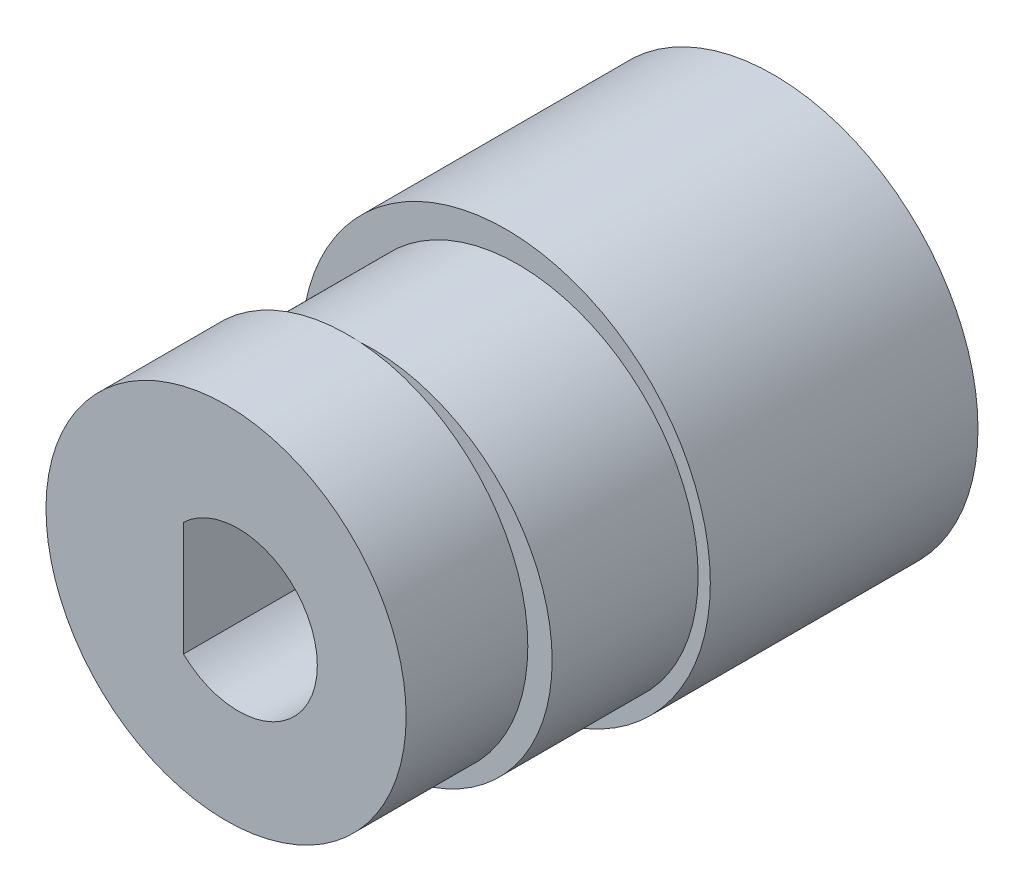
ISO-10303-21;
HEADER;
FILE_DESCRIPTION(('STEP AP214'),'2;1');
FILE_NAME('part.step','',(''),(''),'','','');
FILE_SCHEMA(('AUTOMOTIVE_DESIGN { 1 0 10303 214 1 1 1 1 }'));
ENDSEC;
DATA;
#1=APPLICATION_CONTEXT('core data for automotive mechanical design processes');
#2=APPLICATION_PROTOCOL_DEFINITION('international standard','automotive_design',2000,#1);
#3=PRODUCT_CONTEXT('',#1,'mechanical');
#4=PRODUCT('Part','Part','',(#3));
#5=PRODUCT_RELATED_PRODUCT_CATEGORY('part','',(#4));
#6=PRODUCT_DEFINITION_FORMATION('','',#4);
#7=PRODUCT_DEFINITION_CONTEXT('part definition',#1,'design');
#8=PRODUCT_DEFINITION('design','',#6,#7);
#9=PRODUCT_DEFINITION_SHAPE('','',#8);
#10=(LENGTH_UNIT() NAMED_UNIT(*) SI_UNIT(.MILLI.,.METRE.));
#11=(NAMED_UNIT(*) PLANE_ANGLE_UNIT() SI_UNIT($,.RADIAN.));
#12=(NAMED_UNIT(*) SI_UNIT($,.STERADIAN.) SOLID_ANGLE_UNIT());
#13=UNCERTAINTY_MEASURE_WITH_UNIT(LENGTH_MEASURE(1.E-05),#10,'distance_accuracy_value','');
#14=(GEOMETRIC_REPRESENTATION_CONTEXT(3) GLOBAL_UNCERTAINTY_ASSIGNED_CONTEXT((#13)) GLOBAL_UNIT_ASSIGNED_CONTEXT((#10,
#11,#12)) REPRESENTATION_CONTEXT('',''));
#15=CARTESIAN_POINT('',(0.,0.,0.));
#16=DIRECTION('',(0.,0.,1.));
#17=DIRECTION('',(1.,0.,0.));
#18=AXIS2_PLACEMENT_3D('',#15,#16,#17);
#19=CARTESIAN_POINT('',(0.,0.,11.));
#20=DIRECTION('',(0.,0.,-1.));
#21=DIRECTION('',(-1.,0.,0.));
#22=AXIS2_PLACEMENT_3D('',#19,#20,#21);
#23=CYLINDRICAL_SURFACE('',#22,8.4);
#24=CARTESIAN_POINT('',(0.,0.,11.));
#25=DIRECTION('',(0.,0.,1.));
#26=DIRECTION('',(1.,0.,0.));
#27=AXIS2_PLACEMENT_3D('',#24,#25,#26);
#28=CIRCLE('',#27,8.4);
#29=CARTESIAN_POINT('',(8.4,0.,11.));
#30=VERTEX_POINT('',#29);
#31=EDGE_CURVE('E104',#30,#30,#28,.T.);
#32=ORIENTED_EDGE('',*,*,#31,.F.);
#33=EDGE_LOOP('',(#32));
#34=FACE_BOUND('',#33,.T.);
#35=CARTESIAN_POINT('',(0.,0.,0.));
#36=DIRECTION('',(0.,0.,1.));
#37=DIRECTION('',(1.,0.,0.));
#38=AXIS2_PLACEMENT_3D('',#35,#36,#37);
#39=CIRCLE('',#38,8.4);
#40=CARTESIAN_POINT('',(8.4,0.,0.));
#41=VERTEX_POINT('',#40);
#42=EDGE_CURVE('E44',#41,#41,#39,.T.);
#43=ORIENTED_EDGE('',*,*,#42,.T.);
#44=EDGE_LOOP('',(#43));
#45=FACE_BOUND('',#44,.T.);
#46=ADVANCED_FACE('F41',(#34,#45),#23,.T.);
#47=CARTESIAN_POINT('',(0.,0.,11.));
#48=DIRECTION('',(0.,0.,1.));
#49=DIRECTION('',(1.,0.,0.));
#50=AXIS2_PLACEMENT_3D('',#47,#48,#49);
#51=PLANE('',#50);
#52=CARTESIAN_POINT('',(0.5,0.,11.));
#53=DIRECTION('',(0.,0.,1.));
#54=DIRECTION('',(1.,0.,0.));
#55=AXIS2_PLACEMENT_3D('',#52,#53,#54);
#56=CIRCLE('',#55,7.4);
#57=CARTESIAN_POINT('',(7.9,0.,11.));
#58=VERTEX_POINT('',#57);
#59=EDGE_CURVE('E49',#58,#58,#56,.T.);
#60=ORIENTED_EDGE('',*,*,#59,.F.);
#61=EDGE_LOOP('',(#60));
#62=FACE_BOUND('',#61,.T.);
#63=ORIENTED_EDGE('',*,*,#31,.T.);
#64=EDGE_LOOP('',(#63));
#65=FACE_BOUND('',#64,.T.);
#66=ADVANCED_FACE('F115',(#62,#65),#51,.T.);
#67=CARTESIAN_POINT('',(0.,0.,0.));
#68=DIRECTION('',(0.,0.,1.));
#69=DIRECTION('',(1.,0.,0.));
#70=AXIS2_PLACEMENT_3D('',#67,#68,#69);
#71=PLANE('',#70);
#72=DIRECTION('',(0.,-1.,0.));
#73=VECTOR('',#72,1.);
#74=CARTESIAN_POINT('',(-2.25,2.34520787991171,0.));
#75=LINE('',#74,#73);
#76=CARTESIAN_POINT('',(-2.25,2.34520787991171,0.));
#77=VERTEX_POINT('',#76);
#78=CARTESIAN_POINT('',(-2.25,-2.34520787991171,0.));
#79=VERTEX_POINT('',#78);
#80=EDGE_CURVE('E89',#77,#79,#75,.T.);
#81=ORIENTED_EDGE('',*,*,#80,.T.);
#82=CARTESIAN_POINT('',(0.,0.,0.));
#83=DIRECTION('',(0.,0.,-1.));
#84=DIRECTION('',(-1.,0.,0.));
#85=AXIS2_PLACEMENT_3D('',#82,#83,#84);
#86=CIRCLE('',#85,3.25);
#87=EDGE_CURVE('E58',#77,#79,#86,.T.);
#88=ORIENTED_EDGE('',*,*,#87,.F.);
#89=EDGE_LOOP('',(#81,#88));
#90=FACE_BOUND('',#89,.T.);
#91=ORIENTED_EDGE('',*,*,#42,.F.);
#92=EDGE_LOOP('',(#91));
#93=FACE_BOUND('',#92,.T.);
#94=ADVANCED_FACE('F112',(#90,#93),#71,.F.);
#95=CARTESIAN_POINT('',(0.5,0.,17.));
#96=DIRECTION('',(0.,0.,-1.));
#97=DIRECTION('',(-1.,0.,0.));
#98=AXIS2_PLACEMENT_3D('',#95,#96,#97);
#99=CYLINDRICAL_SURFACE('',#98,7.4);
#100=CARTESIAN_POINT('',(0.5,0.,17.));
#101=DIRECTION('',(0.,0.,1.));
#102=DIRECTION('',(1.,0.,0.));
#103=AXIS2_PLACEMENT_3D('',#100,#101,#102);
#104=CIRCLE('',#103,7.4);
#105=CARTESIAN_POINT('',(0.,7.38308878451289,17.));
#106=VERTEX_POINT('',#105);
#107=CARTESIAN_POINT('',(0.,-7.38308878451289,17.));
#108=VERTEX_POINT('',#107);
#109=EDGE_CURVE('E100',#106,#108,#104,.T.);
#110=ORIENTED_EDGE('',*,*,#109,.F.);
#111=EDGE_CURVE('E97',#108,#106,#104,.T.);
#112=ORIENTED_EDGE('',*,*,#111,.F.);
#113=EDGE_LOOP('',(#110,#112));
#114=FACE_BOUND('',#113,.T.);
#115=ORIENTED_EDGE('',*,*,#59,.T.);
#116=EDGE_LOOP('',(#115));
#117=FACE_BOUND('',#116,.T.);
#118=ADVANCED_FACE('F114',(#114,#117),#99,.T.);
#119=CARTESIAN_POINT('',(0.5,0.,17.));
#120=DIRECTION('',(0.,0.,1.));
#121=DIRECTION('',(1.,0.,0.));
#122=AXIS2_PLACEMENT_3D('',#119,#120,#121);
#123=PLANE('',#122);
#124=CARTESIAN_POINT('',(-0.5,0.,17.));
#125=DIRECTION('',(0.,0.,1.));
#126=DIRECTION('',(1.,0.,0.));
#127=AXIS2_PLACEMENT_3D('',#124,#125,#126);
#128=CIRCLE('',#127,7.4);
#129=EDGE_CURVE('E11',#108,#106,#128,.T.);
#130=ORIENTED_EDGE('',*,*,#129,.F.);
#131=ORIENTED_EDGE('',*,*,#111,.T.);
#132=EDGE_LOOP('',(#130,#131));
#133=FACE_BOUND('',#132,.T.);
#134=ADVANCED_FACE('F122',(#133),#123,.T.);
#135=CARTESIAN_POINT('',(-0.5,0.,17.));
#136=DIRECTION('',(0.,0.,1.));
#137=DIRECTION('',(1.,0.,0.));
#138=AXIS2_PLACEMENT_3D('',#135,#136,#137);
#139=PLANE('',#138);
#140=EDGE_CURVE('E51',#106,#108,#128,.T.);
#141=ORIENTED_EDGE('',*,*,#140,.F.);
#142=ORIENTED_EDGE('',*,*,#109,.T.);
#143=EDGE_LOOP('',(#141,#142));
#144=FACE_BOUND('',#143,.T.);
#145=ADVANCED_FACE('F149',(#144),#139,.F.);
#146=CARTESIAN_POINT('',(-0.5,0.,22.));
#147=DIRECTION('',(0.,0.,-1.));
#148=DIRECTION('',(-1.,0.,0.));
#149=AXIS2_PLACEMENT_3D('',#146,#147,#148);
#150=CYLINDRICAL_SURFACE('',#149,7.4);
#151=CARTESIAN_POINT('',(-0.5,0.,22.));
#152=DIRECTION('',(0.,0.,1.));
#153=DIRECTION('',(1.,0.,0.));
#154=AXIS2_PLACEMENT_3D('',#151,#152,#153);
#155=CIRCLE('',#154,7.4);
#156=CARTESIAN_POINT('',(6.9,0.,22.));
#157=VERTEX_POINT('',#156);
#158=EDGE_CURVE('E95',#157,#157,#155,.T.);
#159=ORIENTED_EDGE('',*,*,#158,.F.);
#160=EDGE_LOOP('',(#159));
#161=FACE_BOUND('',#160,.T.);
#162=ORIENTED_EDGE('',*,*,#140,.T.);
#163=ORIENTED_EDGE('',*,*,#129,.T.);
#164=EDGE_LOOP('',(#162,#163));
#165=FACE_BOUND('',#164,.T.);
#166=ADVANCED_FACE('F157',(#161,#165),#150,.T.);
#167=CARTESIAN_POINT('',(-0.5,0.,22.));
#168=DIRECTION('',(0.,0.,1.));
#169=DIRECTION('',(1.,0.,0.));
#170=AXIS2_PLACEMENT_3D('',#167,#168,#169);
#171=PLANE('',#170);
#172=CARTESIAN_POINT('',(0.,0.,22.));
#173=DIRECTION('',(0.,0.,-1.));
#174=DIRECTION('',(-1.,0.,0.));
#175=AXIS2_PLACEMENT_3D('',#172,#173,#174);
#176=CIRCLE('',#175,3.25);
#177=CARTESIAN_POINT('',(-2.25,2.34520787991171,22.));
#178=VERTEX_POINT('',#177);
#179=CARTESIAN_POINT('',(-2.25,-2.34520787991171,22.));
#180=VERTEX_POINT('',#179);
#181=EDGE_CURVE('E63',#178,#180,#176,.T.);
#182=ORIENTED_EDGE('',*,*,#181,.T.);
#183=DIRECTION('',(0.,-1.,0.));
#184=VECTOR('',#183,1.);
#185=CARTESIAN_POINT('',(-2.25,2.34520787991171,22.));
#186=LINE('',#185,#184);
#187=EDGE_CURVE('E77',#178,#180,#186,.T.);
#188=ORIENTED_EDGE('',*,*,#187,.F.);
#189=EDGE_LOOP('',(#182,#188));
#190=FACE_BOUND('',#189,.T.);
#191=ORIENTED_EDGE('',*,*,#158,.T.);
#192=EDGE_LOOP('',(#191));
#193=FACE_BOUND('',#192,.T.);
#194=ADVANCED_FACE('F87',(#190,#193),#171,.T.);
#195=CARTESIAN_POINT('',(0.,0.,22.));
#196=DIRECTION('',(0.,0.,-1.));
#197=DIRECTION('',(-1.,0.,0.));
#198=AXIS2_PLACEMENT_3D('',#195,#196,#197);
#199=CYLINDRICAL_SURFACE('',#198,3.25);
#200=ORIENTED_EDGE('',*,*,#87,.T.);
#201=DIRECTION('',(0.,0.,-1.));
#202=VECTOR('',#201,1.);
#203=CARTESIAN_POINT('',(-2.25,-2.34520787991171,22.));
#204=LINE('',#203,#202);
#205=EDGE_CURVE('E80',#180,#79,#204,.T.);
#206=ORIENTED_EDGE('',*,*,#205,.F.);
#207=ORIENTED_EDGE('',*,*,#181,.F.);
#208=DIRECTION('',(0.,0.,-1.));
#209=VECTOR('',#208,1.);
#210=CARTESIAN_POINT('',(-2.25,2.34520787991171,22.));
#211=LINE('',#210,#209);
#212=EDGE_CURVE('E82',#178,#77,#211,.T.);
#213=ORIENTED_EDGE('',*,*,#212,.T.);
#214=EDGE_LOOP('',(#200,#206,#207,#213));
#215=FACE_BOUND('',#214,.T.);
#216=ADVANCED_FACE('F85',(#215),#199,.F.);
#217=CARTESIAN_POINT('',(-2.25,2.34520787991171,22.));
#218=DIRECTION('',(1.,0.,0.));
#219=DIRECTION('',(0.,0.,-1.));
#220=AXIS2_PLACEMENT_3D('',#217,#218,#219);
#221=PLANE('',#220);
#222=ORIENTED_EDGE('',*,*,#80,.F.);
#223=ORIENTED_EDGE('',*,*,#212,.F.);
#224=ORIENTED_EDGE('',*,*,#187,.T.);
#225=ORIENTED_EDGE('',*,*,#205,.T.);
#226=EDGE_LOOP('',(#222,#223,#224,#225));
#227=FACE_BOUND('',#226,.T.);
#228=ADVANCED_FACE('F79',(#227),#221,.T.);
#229=CLOSED_SHELL('',(#46,#66,#94,#118,#134,#145,#166,#194,#216,#228));
#230=MANIFOLD_SOLID_BREP('B2',#229);
#231=ADVANCED_BREP_SHAPE_REPRESENTATION('',(#18,#230),#14);
#232=SHAPE_DEFINITION_REPRESENTATION(#9,#231);
ENDSEC;
END-ISO-10303-21;
